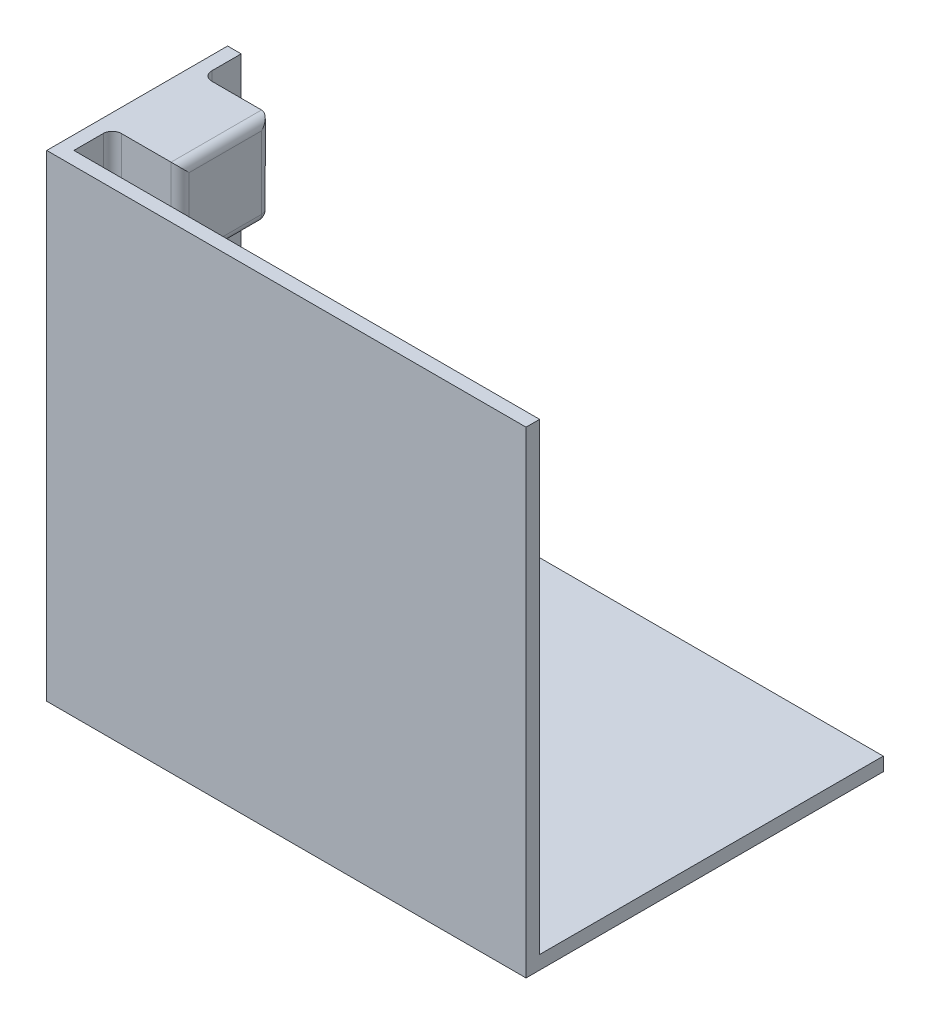
ISO-10303-21;
HEADER;
FILE_DESCRIPTION(('STEP AP214'),'2;1');
FILE_NAME('part.step','',(''),(''),'','','');
FILE_SCHEMA(('AUTOMOTIVE_DESIGN { 1 0 10303 214 1 1 1 1 }'));
ENDSEC;
DATA;
#1=APPLICATION_CONTEXT('core data for automotive mechanical design processes');
#2=APPLICATION_PROTOCOL_DEFINITION('international standard','automotive_design',2000,#1);
#3=PRODUCT_CONTEXT('',#1,'mechanical');
#4=PRODUCT('Part','Part','',(#3));
#5=PRODUCT_RELATED_PRODUCT_CATEGORY('part','',(#4));
#6=PRODUCT_DEFINITION_FORMATION('','',#4);
#7=PRODUCT_DEFINITION_CONTEXT('part definition',#1,'design');
#8=PRODUCT_DEFINITION('design','',#6,#7);
#9=PRODUCT_DEFINITION_SHAPE('','',#8);
#10=(LENGTH_UNIT() NAMED_UNIT(*) SI_UNIT(.MILLI.,.METRE.));
#11=(NAMED_UNIT(*) PLANE_ANGLE_UNIT() SI_UNIT($,.RADIAN.));
#12=(NAMED_UNIT(*) SI_UNIT($,.STERADIAN.) SOLID_ANGLE_UNIT());
#13=UNCERTAINTY_MEASURE_WITH_UNIT(LENGTH_MEASURE(1.E-05),#10,'distance_accuracy_value','');
#14=(GEOMETRIC_REPRESENTATION_CONTEXT(3) GLOBAL_UNCERTAINTY_ASSIGNED_CONTEXT((#13)) GLOBAL_UNIT_ASSIGNED_CONTEXT((#10,
#11,#12)) REPRESENTATION_CONTEXT('',''));
#15=CARTESIAN_POINT('',(0.,0.,0.));
#16=DIRECTION('',(0.,0.,1.));
#17=DIRECTION('',(1.,0.,0.));
#18=AXIS2_PLACEMENT_3D('',#15,#16,#17);
#19=CARTESIAN_POINT('',(-50.,0.,36.5));
#20=DIRECTION('',(-1.,0.,0.));
#21=DIRECTION('',(0.,0.,1.));
#22=AXIS2_PLACEMENT_3D('',#19,#20,#21);
#23=PLANE('',#22);
#24=CARTESIAN_POINT('',(-50.,87.5,26.));
#25=DIRECTION('',(-1.,0.,0.));
#26=DIRECTION('',(0.,0.,1.));
#27=AXIS2_PLACEMENT_3D('',#24,#25,#26);
#28=CIRCLE('',#27,4.);
#29=CARTESIAN_POINT('',(-50.,87.5,30.));
#30=VERTEX_POINT('',#29);
#31=CARTESIAN_POINT('',(-50.,83.5,26.));
#32=VERTEX_POINT('',#31);
#33=EDGE_CURVE('E248',#30,#32,#28,.F.);
#34=ORIENTED_EDGE('',*,*,#33,.F.);
#35=DIRECTION('',(0.,-1.,0.));
#36=VECTOR('',#35,1.);
#37=CARTESIAN_POINT('',(-50.,105.5,30.));
#38=LINE('',#37,#36);
#39=CARTESIAN_POINT('',(-50.,105.5,30.));
#40=VERTEX_POINT('',#39);
#41=EDGE_CURVE('E251',#30,#40,#38,.F.);
#42=ORIENTED_EDGE('',*,*,#41,.T.);
#43=DIRECTION('',(0.,0.,1.));
#44=VECTOR('',#43,1.);
#45=CARTESIAN_POINT('',(-50.,105.5,36.5));
#46=LINE('',#45,#44);
#47=CARTESIAN_POINT('',(-50.,105.5,36.5));
#48=VERTEX_POINT('',#47);
#49=EDGE_CURVE('E338',#40,#48,#46,.T.);
#50=ORIENTED_EDGE('',*,*,#49,.T.);
#51=DIRECTION('',(0.,1.,0.));
#52=VECTOR('',#51,1.);
#53=CARTESIAN_POINT('',(-50.,0.,36.5));
#54=LINE('',#53,#52);
#55=CARTESIAN_POINT('',(-50.,3.,36.5));
#56=VERTEX_POINT('',#55);
#57=EDGE_CURVE('E177',#56,#48,#54,.T.);
#58=ORIENTED_EDGE('',*,*,#57,.F.);
#59=DIRECTION('',(0.,0.,-1.));
#60=VECTOR('',#59,1.);
#61=CARTESIAN_POINT('',(-50.,3.,36.5));
#62=LINE('',#61,#60);
#63=CARTESIAN_POINT('',(-50.,3.,-0.5));
#64=VERTEX_POINT('',#63);
#65=EDGE_CURVE('E219',#56,#64,#62,.T.);
#66=ORIENTED_EDGE('',*,*,#65,.T.);
#67=DIRECTION('',(0.,-1.,0.));
#68=VECTOR('',#67,1.);
#69=CARTESIAN_POINT('',(-50.,0.,-0.5));
#70=LINE('',#69,#68);
#71=CARTESIAN_POINT('',(-50.,105.5,-0.5));
#72=VERTEX_POINT('',#71);
#73=EDGE_CURVE('E335',#72,#64,#70,.T.);
#74=ORIENTED_EDGE('',*,*,#73,.F.);
#75=CARTESIAN_POINT('',(-50.,105.5,6.));
#76=VERTEX_POINT('',#75);
#77=EDGE_CURVE('E182',#72,#76,#46,.T.);
#78=ORIENTED_EDGE('',*,*,#77,.T.);
#79=DIRECTION('',(0.,1.,0.));
#80=VECTOR('',#79,1.);
#81=CARTESIAN_POINT('',(-50.,85.5,5.99999999999999));
#82=LINE('',#81,#80);
#83=CARTESIAN_POINT('',(-50.,87.5,6.));
#84=VERTEX_POINT('',#83);
#85=EDGE_CURVE('E243',#76,#84,#82,.F.);
#86=ORIENTED_EDGE('',*,*,#85,.T.);
#87=CARTESIAN_POINT('',(-50.,87.5,9.99999999999999));
#88=DIRECTION('',(-1.,0.,0.));
#89=DIRECTION('',(0.,0.,1.));
#90=AXIS2_PLACEMENT_3D('',#87,#88,#89);
#91=CIRCLE('',#90,4.);
#92=CARTESIAN_POINT('',(-50.,83.5,9.99999999999999));
#93=VERTEX_POINT('',#92);
#94=EDGE_CURVE('E240',#93,#84,#91,.F.);
#95=ORIENTED_EDGE('',*,*,#94,.F.);
#96=DIRECTION('',(0.,0.,-1.));
#97=VECTOR('',#96,1.);
#98=CARTESIAN_POINT('',(-50.,83.5,28.));
#99=LINE('',#98,#97);
#100=EDGE_CURVE('E245',#93,#32,#99,.F.);
#101=ORIENTED_EDGE('',*,*,#100,.T.);
#102=EDGE_LOOP('',(#34,#42,#50,#58,#66,#74,#78,#86,#95,#101));
#103=FACE_BOUND('',#102,.T.);
#104=ADVANCED_FACE('F39',(#103),#23,.F.);
#105=CARTESIAN_POINT('',(0.,105.5,0.));
#106=DIRECTION('',(0.,1.,0.));
#107=DIRECTION('',(0.,0.,1.));
#108=AXIS2_PLACEMENT_3D('',#105,#106,#107);
#109=PLANE('',#108);
#110=DIRECTION('',(-1.,0.,0.));
#111=VECTOR('',#110,1.);
#112=CARTESIAN_POINT('',(-35.,105.5,28.));
#113=LINE('',#112,#111);
#114=CARTESIAN_POINT('',(-37.,105.5,28.));
#115=VERTEX_POINT('',#114);
#116=CARTESIAN_POINT('',(-48.,105.5,28.));
#117=VERTEX_POINT('',#116);
#118=EDGE_CURVE('E313',#115,#117,#113,.T.);
#119=ORIENTED_EDGE('',*,*,#118,.F.);
#120=DIRECTION('',(0.,0.,1.));
#121=VECTOR('',#120,1.);
#122=CARTESIAN_POINT('',(-37.,105.5,8.));
#123=LINE('',#122,#121);
#124=CARTESIAN_POINT('',(-37.,105.5,8.));
#125=VERTEX_POINT('',#124);
#126=EDGE_CURVE('E262',#115,#125,#123,.F.);
#127=ORIENTED_EDGE('',*,*,#126,.T.);
#128=DIRECTION('',(-1.,0.,0.));
#129=VECTOR('',#128,1.);
#130=CARTESIAN_POINT('',(-35.,105.5,8.));
#131=LINE('',#130,#129);
#132=CARTESIAN_POINT('',(-48.,105.5,8.));
#133=VERTEX_POINT('',#132);
#134=EDGE_CURVE('E192',#125,#133,#131,.T.);
#135=ORIENTED_EDGE('',*,*,#134,.T.);
#136=CARTESIAN_POINT('',(-48.,105.5,6.));
#137=DIRECTION('',(0.,1.,0.));
#138=DIRECTION('',(0.,0.,1.));
#139=AXIS2_PLACEMENT_3D('',#136,#137,#138);
#140=CIRCLE('',#139,2.);
#141=EDGE_CURVE('E11',#133,#76,#140,.F.);
#142=ORIENTED_EDGE('',*,*,#141,.T.);
#143=ORIENTED_EDGE('',*,*,#77,.F.);
#144=DIRECTION('',(1.,0.,0.));
#145=VECTOR('',#144,1.);
#146=CARTESIAN_POINT('',(53.,105.5,-0.5));
#147=LINE('',#146,#145);
#148=CARTESIAN_POINT('',(-53.,105.5,-0.5));
#149=VERTEX_POINT('',#148);
#150=EDGE_CURVE('E329',#149,#72,#147,.T.);
#151=ORIENTED_EDGE('',*,*,#150,.F.);
#152=DIRECTION('',(0.,0.,1.));
#153=VECTOR('',#152,1.);
#154=CARTESIAN_POINT('',(-53.,105.5,-39.5));
#155=LINE('',#154,#153);
#156=CARTESIAN_POINT('',(-53.,105.5,39.5));
#157=VERTEX_POINT('',#156);
#158=EDGE_CURVE('E181',#149,#157,#155,.T.);
#159=ORIENTED_EDGE('',*,*,#158,.T.);
#160=DIRECTION('',(1.,0.,0.));
#161=VECTOR('',#160,1.);
#162=CARTESIAN_POINT('',(-53.,105.5,39.5));
#163=LINE('',#162,#161);
#164=CARTESIAN_POINT('',(53.,105.5,39.5));
#165=VERTEX_POINT('',#164);
#166=EDGE_CURVE('E198',#157,#165,#163,.T.);
#167=ORIENTED_EDGE('',*,*,#166,.T.);
#168=DIRECTION('',(0.,0.,-1.));
#169=VECTOR('',#168,1.);
#170=CARTESIAN_POINT('',(53.,105.5,39.5));
#171=LINE('',#170,#169);
#172=CARTESIAN_POINT('',(53.,105.5,36.5));
#173=VERTEX_POINT('',#172);
#174=EDGE_CURVE('E188',#165,#173,#171,.T.);
#175=ORIENTED_EDGE('',*,*,#174,.T.);
#176=DIRECTION('',(1.,0.,0.));
#177=VECTOR('',#176,1.);
#178=CARTESIAN_POINT('',(-50.,105.5,36.5));
#179=LINE('',#178,#177);
#180=EDGE_CURVE('E172',#48,#173,#179,.T.);
#181=ORIENTED_EDGE('',*,*,#180,.F.);
#182=ORIENTED_EDGE('',*,*,#49,.F.);
#183=CARTESIAN_POINT('',(-48.,105.5,30.));
#184=DIRECTION('',(0.,1.,0.));
#185=DIRECTION('',(0.,0.,1.));
#186=AXIS2_PLACEMENT_3D('',#183,#184,#185);
#187=CIRCLE('',#186,2.);
#188=EDGE_CURVE('E48',#40,#117,#187,.F.);
#189=ORIENTED_EDGE('',*,*,#188,.T.);
#190=EDGE_LOOP('',(#119,#127,#135,#142,#143,#151,#159,#167,#175,#181,#182,#189));
#191=FACE_BOUND('',#190,.T.);
#192=ADVANCED_FACE('F196',(#191),#109,.T.);
#193=CARTESIAN_POINT('',(0.,3.,0.));
#194=DIRECTION('',(0.,-1.,0.));
#195=DIRECTION('',(0.,0.,-1.));
#196=AXIS2_PLACEMENT_3D('',#193,#194,#195);
#197=PLANE('',#196);
#198=DIRECTION('',(-1.,0.,0.));
#199=VECTOR('',#198,1.);
#200=CARTESIAN_POINT('',(53.,3.,-0.5));
#201=LINE('',#200,#199);
#202=CARTESIAN_POINT('',(-53.,3.,-0.5));
#203=VERTEX_POINT('',#202);
#204=EDGE_CURVE('E325',#64,#203,#201,.T.);
#205=ORIENTED_EDGE('',*,*,#204,.F.);
#206=ORIENTED_EDGE('',*,*,#65,.F.);
#207=DIRECTION('',(1.,0.,0.));
#208=VECTOR('',#207,1.);
#209=CARTESIAN_POINT('',(-50.,3.,36.5));
#210=LINE('',#209,#208);
#211=CARTESIAN_POINT('',(53.,3.,36.5));
#212=VERTEX_POINT('',#211);
#213=EDGE_CURVE('E229',#56,#212,#210,.T.);
#214=ORIENTED_EDGE('',*,*,#213,.T.);
#215=DIRECTION('',(0.,0.,-1.));
#216=VECTOR('',#215,1.);
#217=CARTESIAN_POINT('',(53.,3.,-0.5));
#218=LINE('',#217,#216);
#219=CARTESIAN_POINT('',(53.,3.,-39.5));
#220=VERTEX_POINT('',#219);
#221=EDGE_CURVE('E190',#212,#220,#218,.T.);
#222=ORIENTED_EDGE('',*,*,#221,.T.);
#223=DIRECTION('',(-1.,0.,0.));
#224=VECTOR('',#223,1.);
#225=CARTESIAN_POINT('',(53.,3.,-39.5));
#226=LINE('',#225,#224);
#227=CARTESIAN_POINT('',(-53.,3.,-39.5));
#228=VERTEX_POINT('',#227);
#229=EDGE_CURVE('E191',#220,#228,#226,.T.);
#230=ORIENTED_EDGE('',*,*,#229,.T.);
#231=DIRECTION('',(0.,0.,-1.));
#232=VECTOR('',#231,1.);
#233=CARTESIAN_POINT('',(-53.,3.,-0.5));
#234=LINE('',#233,#232);
#235=EDGE_CURVE('E332',#203,#228,#234,.T.);
#236=ORIENTED_EDGE('',*,*,#235,.F.);
#237=EDGE_LOOP('',(#205,#206,#214,#222,#230,#236));
#238=FACE_BOUND('',#237,.T.);
#239=ADVANCED_FACE('F360',(#238),#197,.F.);
#240=CARTESIAN_POINT('',(-50.,0.,36.5));
#241=DIRECTION('',(0.,0.,1.));
#242=DIRECTION('',(1.,0.,0.));
#243=AXIS2_PLACEMENT_3D('',#240,#241,#242);
#244=PLANE('',#243);
#245=ORIENTED_EDGE('',*,*,#180,.T.);
#246=DIRECTION('',(0.,-1.,0.));
#247=VECTOR('',#246,1.);
#248=CARTESIAN_POINT('',(53.,105.5,36.5));
#249=LINE('',#248,#247);
#250=EDGE_CURVE('E175',#173,#212,#249,.T.);
#251=ORIENTED_EDGE('',*,*,#250,.T.);
#252=ORIENTED_EDGE('',*,*,#213,.F.);
#253=ORIENTED_EDGE('',*,*,#57,.T.);
#254=EDGE_LOOP('',(#245,#251,#252,#253));
#255=FACE_BOUND('',#254,.T.);
#256=ADVANCED_FACE('F174',(#255),#244,.F.);
#257=CARTESIAN_POINT('',(53.,0.,-39.5));
#258=DIRECTION('',(0.,0.,-1.));
#259=DIRECTION('',(-1.,0.,0.));
#260=AXIS2_PLACEMENT_3D('',#257,#258,#259);
#261=PLANE('',#260);
#262=ORIENTED_EDGE('',*,*,#229,.F.);
#263=DIRECTION('',(0.,1.,0.));
#264=VECTOR('',#263,1.);
#265=CARTESIAN_POINT('',(53.,0.,-39.5));
#266=LINE('',#265,#264);
#267=CARTESIAN_POINT('',(53.,0.,-39.5));
#268=VERTEX_POINT('',#267);
#269=EDGE_CURVE('E217',#268,#220,#266,.T.);
#270=ORIENTED_EDGE('',*,*,#269,.F.);
#271=DIRECTION('',(-1.,0.,0.));
#272=VECTOR('',#271,1.);
#273=CARTESIAN_POINT('',(53.,0.,-39.5));
#274=LINE('',#273,#272);
#275=CARTESIAN_POINT('',(-53.,0.,-39.5));
#276=VERTEX_POINT('',#275);
#277=EDGE_CURVE('E200',#268,#276,#274,.T.);
#278=ORIENTED_EDGE('',*,*,#277,.T.);
#279=DIRECTION('',(0.,1.,0.));
#280=VECTOR('',#279,1.);
#281=CARTESIAN_POINT('',(-53.,0.,-39.5));
#282=LINE('',#281,#280);
#283=EDGE_CURVE('E216',#276,#228,#282,.T.);
#284=ORIENTED_EDGE('',*,*,#283,.T.);
#285=EDGE_LOOP('',(#262,#270,#278,#284));
#286=FACE_BOUND('',#285,.T.);
#287=ADVANCED_FACE('F356',(#286),#261,.T.);
#288=CARTESIAN_POINT('',(53.,0.,39.5));
#289=DIRECTION('',(1.,0.,0.));
#290=DIRECTION('',(0.,0.,-1.));
#291=AXIS2_PLACEMENT_3D('',#288,#289,#290);
#292=PLANE('',#291);
#293=ORIENTED_EDGE('',*,*,#250,.F.);
#294=ORIENTED_EDGE('',*,*,#174,.F.);
#295=DIRECTION('',(0.,1.,0.));
#296=VECTOR('',#295,1.);
#297=CARTESIAN_POINT('',(53.,0.,39.5));
#298=LINE('',#297,#296);
#299=CARTESIAN_POINT('',(53.,0.,39.5));
#300=VERTEX_POINT('',#299);
#301=EDGE_CURVE('E220',#300,#165,#298,.T.);
#302=ORIENTED_EDGE('',*,*,#301,.F.);
#303=DIRECTION('',(0.,0.,-1.));
#304=VECTOR('',#303,1.);
#305=CARTESIAN_POINT('',(53.,0.,39.5));
#306=LINE('',#305,#304);
#307=EDGE_CURVE('E213',#300,#268,#306,.T.);
#308=ORIENTED_EDGE('',*,*,#307,.T.);
#309=ORIENTED_EDGE('',*,*,#269,.T.);
#310=ORIENTED_EDGE('',*,*,#221,.F.);
#311=EDGE_LOOP('',(#293,#294,#302,#308,#309,#310));
#312=FACE_BOUND('',#311,.T.);
#313=ADVANCED_FACE('F187',(#312),#292,.T.);
#314=CARTESIAN_POINT('',(-53.,0.,39.5));
#315=DIRECTION('',(0.,0.,1.));
#316=DIRECTION('',(1.,0.,0.));
#317=AXIS2_PLACEMENT_3D('',#314,#315,#316);
#318=PLANE('',#317);
#319=ORIENTED_EDGE('',*,*,#301,.T.);
#320=ORIENTED_EDGE('',*,*,#166,.F.);
#321=DIRECTION('',(0.,1.,0.));
#322=VECTOR('',#321,1.);
#323=CARTESIAN_POINT('',(-53.,0.,39.5));
#324=LINE('',#323,#322);
#325=CARTESIAN_POINT('',(-53.,0.,39.5));
#326=VERTEX_POINT('',#325);
#327=EDGE_CURVE('E222',#326,#157,#324,.T.);
#328=ORIENTED_EDGE('',*,*,#327,.F.);
#329=DIRECTION('',(1.,0.,0.));
#330=VECTOR('',#329,1.);
#331=CARTESIAN_POINT('',(-53.,0.,39.5));
#332=LINE('',#331,#330);
#333=EDGE_CURVE('E210',#326,#300,#332,.T.);
#334=ORIENTED_EDGE('',*,*,#333,.T.);
#335=EDGE_LOOP('',(#319,#320,#328,#334));
#336=FACE_BOUND('',#335,.T.);
#337=ADVANCED_FACE('F349',(#336),#318,.T.);
#338=CARTESIAN_POINT('',(-53.,0.,-39.5));
#339=DIRECTION('',(-1.,0.,0.));
#340=DIRECTION('',(0.,0.,1.));
#341=AXIS2_PLACEMENT_3D('',#338,#339,#340);
#342=PLANE('',#341);
#343=ORIENTED_EDGE('',*,*,#235,.T.);
#344=ORIENTED_EDGE('',*,*,#283,.F.);
#345=DIRECTION('',(0.,0.,1.));
#346=VECTOR('',#345,1.);
#347=CARTESIAN_POINT('',(-53.,0.,-39.5));
#348=LINE('',#347,#346);
#349=EDGE_CURVE('E207',#276,#326,#348,.T.);
#350=ORIENTED_EDGE('',*,*,#349,.T.);
#351=ORIENTED_EDGE('',*,*,#327,.T.);
#352=ORIENTED_EDGE('',*,*,#158,.F.);
#353=DIRECTION('',(0.,1.,0.));
#354=VECTOR('',#353,1.);
#355=CARTESIAN_POINT('',(-53.,105.5,-0.5));
#356=LINE('',#355,#354);
#357=EDGE_CURVE('E327',#203,#149,#356,.T.);
#358=ORIENTED_EDGE('',*,*,#357,.F.);
#359=EDGE_LOOP('',(#343,#344,#350,#351,#352,#358));
#360=FACE_BOUND('',#359,.T.);
#361=ADVANCED_FACE('F345',(#360),#342,.T.);
#362=CARTESIAN_POINT('',(0.,0.,0.));
#363=DIRECTION('',(0.,-1.,0.));
#364=DIRECTION('',(0.,0.,-1.));
#365=AXIS2_PLACEMENT_3D('',#362,#363,#364);
#366=PLANE('',#365);
#367=ORIENTED_EDGE('',*,*,#277,.F.);
#368=ORIENTED_EDGE('',*,*,#307,.F.);
#369=ORIENTED_EDGE('',*,*,#333,.F.);
#370=ORIENTED_EDGE('',*,*,#349,.F.);
#371=EDGE_LOOP('',(#367,#368,#369,#370));
#372=FACE_BOUND('',#371,.T.);
#373=ADVANCED_FACE('F353',(#372),#366,.T.);
#374=CARTESIAN_POINT('',(0.,0.,-0.5));
#375=DIRECTION('',(0.,0.,-1.));
#376=DIRECTION('',(-1.,0.,0.));
#377=AXIS2_PLACEMENT_3D('',#374,#375,#376);
#378=PLANE('',#377);
#379=ORIENTED_EDGE('',*,*,#73,.T.);
#380=ORIENTED_EDGE('',*,*,#204,.T.);
#381=ORIENTED_EDGE('',*,*,#357,.T.);
#382=ORIENTED_EDGE('',*,*,#150,.T.);
#383=EDGE_LOOP('',(#379,#380,#381,#382));
#384=FACE_BOUND('',#383,.T.);
#385=ADVANCED_FACE('F362',(#384),#378,.T.);
#386=CARTESIAN_POINT('',(-35.,105.5,8.));
#387=DIRECTION('',(0.,0.,1.));
#388=DIRECTION('',(0.,-1.,0.));
#389=AXIS2_PLACEMENT_3D('',#386,#387,#388);
#390=PLANE('',#389);
#391=ORIENTED_EDGE('',*,*,#134,.F.);
#392=DIRECTION('',(0.,1.,0.));
#393=VECTOR('',#392,1.);
#394=CARTESIAN_POINT('',(-37.,105.5,8.));
#395=LINE('',#394,#393);
#396=CARTESIAN_POINT('',(-37.,87.5,7.99999999999999));
#397=VERTEX_POINT('',#396);
#398=EDGE_CURVE('E56',#125,#397,#395,.F.);
#399=ORIENTED_EDGE('',*,*,#398,.T.);
#400=DIRECTION('',(-1.,0.,0.));
#401=VECTOR('',#400,1.);
#402=CARTESIAN_POINT('',(-35.,87.5,7.99999999999999));
#403=LINE('',#402,#401);
#404=CARTESIAN_POINT('',(-48.,87.5,7.99999999999999));
#405=VERTEX_POINT('',#404);
#406=EDGE_CURVE('E61',#397,#405,#403,.T.);
#407=ORIENTED_EDGE('',*,*,#406,.T.);
#408=DIRECTION('',(0.,1.,0.));
#409=VECTOR('',#408,1.);
#410=CARTESIAN_POINT('',(-48.,105.5,8.));
#411=LINE('',#410,#409);
#412=EDGE_CURVE('E270',#405,#133,#411,.T.);
#413=ORIENTED_EDGE('',*,*,#412,.T.);
#414=EDGE_LOOP('',(#391,#399,#407,#413));
#415=FACE_BOUND('',#414,.T.);
#416=ADVANCED_FACE('F404',(#415),#390,.F.);
#417=CARTESIAN_POINT('',(-35.,105.5,28.));
#418=DIRECTION('',(0.,0.,-1.));
#419=DIRECTION('',(-1.,0.,0.));
#420=AXIS2_PLACEMENT_3D('',#417,#418,#419);
#421=PLANE('',#420);
#422=DIRECTION('',(-1.,0.,0.));
#423=VECTOR('',#422,1.);
#424=CARTESIAN_POINT('',(-35.,87.5,28.));
#425=LINE('',#424,#423);
#426=CARTESIAN_POINT('',(-48.,87.5,28.));
#427=VERTEX_POINT('',#426);
#428=CARTESIAN_POINT('',(-37.,87.5,28.));
#429=VERTEX_POINT('',#428);
#430=EDGE_CURVE('E266',#427,#429,#425,.F.);
#431=ORIENTED_EDGE('',*,*,#430,.T.);
#432=DIRECTION('',(0.,-1.,0.));
#433=VECTOR('',#432,1.);
#434=CARTESIAN_POINT('',(-37.,105.5,28.));
#435=LINE('',#434,#433);
#436=EDGE_CURVE('E268',#429,#115,#435,.F.);
#437=ORIENTED_EDGE('',*,*,#436,.T.);
#438=ORIENTED_EDGE('',*,*,#118,.T.);
#439=DIRECTION('',(0.,-1.,0.));
#440=VECTOR('',#439,1.);
#441=CARTESIAN_POINT('',(-48.,85.5,28.));
#442=LINE('',#441,#440);
#443=EDGE_CURVE('E264',#117,#427,#442,.T.);
#444=ORIENTED_EDGE('',*,*,#443,.T.);
#445=EDGE_LOOP('',(#431,#437,#438,#444));
#446=FACE_BOUND('',#445,.T.);
#447=ADVANCED_FACE('F372',(#446),#421,.F.);
#448=CARTESIAN_POINT('',(-35.,85.5,7.99999999999999));
#449=DIRECTION('',(0.,1.,0.));
#450=DIRECTION('',(0.,0.,1.));
#451=AXIS2_PLACEMENT_3D('',#448,#449,#450);
#452=PLANE('',#451);
#453=DIRECTION('',(0.,0.,-1.));
#454=VECTOR('',#453,1.);
#455=CARTESIAN_POINT('',(-37.,85.5,7.99999999999999));
#456=LINE('',#455,#454);
#457=CARTESIAN_POINT('',(-37.,85.5,9.99999999999999));
#458=VERTEX_POINT('',#457);
#459=CARTESIAN_POINT('',(-37.,85.5,26.));
#460=VERTEX_POINT('',#459);
#461=EDGE_CURVE('E233',#458,#460,#456,.F.);
#462=ORIENTED_EDGE('',*,*,#461,.T.);
#463=DIRECTION('',(-1.,0.,0.));
#464=VECTOR('',#463,1.);
#465=CARTESIAN_POINT('',(-35.,85.5,26.));
#466=LINE('',#465,#464);
#467=CARTESIAN_POINT('',(-48.,85.5,26.));
#468=VERTEX_POINT('',#467);
#469=EDGE_CURVE('E238',#460,#468,#466,.T.);
#470=ORIENTED_EDGE('',*,*,#469,.T.);
#471=DIRECTION('',(0.,0.,-1.));
#472=VECTOR('',#471,1.);
#473=CARTESIAN_POINT('',(-48.,85.5,8.));
#474=LINE('',#473,#472);
#475=CARTESIAN_POINT('',(-48.,85.5,9.99999999999999));
#476=VERTEX_POINT('',#475);
#477=EDGE_CURVE('E235',#468,#476,#474,.T.);
#478=ORIENTED_EDGE('',*,*,#477,.T.);
#479=DIRECTION('',(-1.,0.,0.));
#480=VECTOR('',#479,1.);
#481=CARTESIAN_POINT('',(-35.,85.5,9.99999999999999));
#482=LINE('',#481,#480);
#483=EDGE_CURVE('E231',#476,#458,#482,.F.);
#484=ORIENTED_EDGE('',*,*,#483,.T.);
#485=EDGE_LOOP('',(#462,#470,#478,#484));
#486=FACE_BOUND('',#485,.T.);
#487=ADVANCED_FACE('F538',(#486),#452,.F.);
#488=CARTESIAN_POINT('',(-35.,0.,0.));
#489=DIRECTION('',(-1.,0.,0.));
#490=DIRECTION('',(0.,0.,1.));
#491=AXIS2_PLACEMENT_3D('',#488,#489,#490);
#492=PLANE('',#491);
#493=DIRECTION('',(0.,0.,1.));
#494=VECTOR('',#493,1.);
#495=CARTESIAN_POINT('',(-35.,103.5,28.));
#496=LINE('',#495,#494);
#497=CARTESIAN_POINT('',(-35.,103.5,10.));
#498=VERTEX_POINT('',#497);
#499=CARTESIAN_POINT('',(-35.,103.5,26.));
#500=VERTEX_POINT('',#499);
#501=EDGE_CURVE('E255',#498,#500,#496,.T.);
#502=ORIENTED_EDGE('',*,*,#501,.T.);
#503=DIRECTION('',(0.,-1.,0.));
#504=VECTOR('',#503,1.);
#505=CARTESIAN_POINT('',(-35.,0.,26.));
#506=LINE('',#505,#504);
#507=CARTESIAN_POINT('',(-35.,87.5,26.));
#508=VERTEX_POINT('',#507);
#509=EDGE_CURVE('E260',#500,#508,#506,.T.);
#510=ORIENTED_EDGE('',*,*,#509,.T.);
#511=DIRECTION('',(0.,0.,-1.));
#512=VECTOR('',#511,1.);
#513=CARTESIAN_POINT('',(-35.,87.5,0.));
#514=LINE('',#513,#512);
#515=CARTESIAN_POINT('',(-35.,87.5,9.99999999999999));
#516=VERTEX_POINT('',#515);
#517=EDGE_CURVE('E257',#508,#516,#514,.T.);
#518=ORIENTED_EDGE('',*,*,#517,.T.);
#519=DIRECTION('',(0.,1.,0.));
#520=VECTOR('',#519,1.);
#521=CARTESIAN_POINT('',(-35.,0.,9.99999999999997));
#522=LINE('',#521,#520);
#523=EDGE_CURVE('E253',#516,#498,#522,.T.);
#524=ORIENTED_EDGE('',*,*,#523,.T.);
#525=EDGE_LOOP('',(#502,#510,#518,#524));
#526=FACE_BOUND('',#525,.T.);
#527=ADVANCED_FACE('F530',(#526),#492,.F.);
#528=CARTESIAN_POINT('',(-37.,103.5,0.));
#529=DIRECTION('',(0.,0.,-1.));
#530=DIRECTION('',(-1.,0.,0.));
#531=AXIS2_PLACEMENT_3D('',#528,#529,#530);
#532=CYLINDRICAL_SURFACE('',#531,2.);
#533=CARTESIAN_POINT('',(-37.,103.5,10.));
#534=DIRECTION('',(0.,0.707106781186547,0.707106781186548));
#535=DIRECTION('',(0.,0.707106781186548,-0.707106781186547));
#536=AXIS2_PLACEMENT_3D('',#533,#534,#535);
#537=ELLIPSE('',#536,2.82842712474619,2.);
#538=EDGE_CURVE('E307',#125,#498,#537,.F.);
#539=ORIENTED_EDGE('',*,*,#538,.F.);
#540=ORIENTED_EDGE('',*,*,#126,.F.);
#541=CARTESIAN_POINT('',(-37.,103.5,26.));
#542=DIRECTION('',(0.,-0.707106781186547,0.707106781186547));
#543=DIRECTION('',(0.,-0.707106781186547,-0.707106781186547));
#544=AXIS2_PLACEMENT_3D('',#541,#542,#543);
#545=ELLIPSE('',#544,2.82842712474619,2.);
#546=EDGE_CURVE('E43',#500,#115,#545,.T.);
#547=ORIENTED_EDGE('',*,*,#546,.F.);
#548=ORIENTED_EDGE('',*,*,#501,.F.);
#549=EDGE_LOOP('',(#539,#540,#547,#548));
#550=FACE_BOUND('',#549,.T.);
#551=ADVANCED_FACE('F41',(#550),#532,.T.);
#552=CARTESIAN_POINT('',(-37.,0.,26.));
#553=DIRECTION('',(0.,-1.,0.));
#554=DIRECTION('',(0.,0.,-1.));
#555=AXIS2_PLACEMENT_3D('',#552,#553,#554);
#556=CYLINDRICAL_SURFACE('',#555,2.);
#557=ORIENTED_EDGE('',*,*,#546,.T.);
#558=ORIENTED_EDGE('',*,*,#436,.F.);
#559=CARTESIAN_POINT('',(-37.,87.5,26.));
#560=DIRECTION('',(0.,-1.,0.));
#561=DIRECTION('',(0.,0.,-1.));
#562=AXIS2_PLACEMENT_3D('',#559,#560,#561);
#563=CIRCLE('',#562,2.);
#564=EDGE_CURVE('E305',#508,#429,#563,.T.);
#565=ORIENTED_EDGE('',*,*,#564,.F.);
#566=ORIENTED_EDGE('',*,*,#509,.F.);
#567=EDGE_LOOP('',(#557,#558,#565,#566));
#568=FACE_BOUND('',#567,.T.);
#569=ADVANCED_FACE('F383',(#568),#556,.T.);
#570=CARTESIAN_POINT('',(-37.,87.5,0.));
#571=DIRECTION('',(0.,0.,-1.));
#572=DIRECTION('',(-1.,0.,0.));
#573=AXIS2_PLACEMENT_3D('',#570,#571,#572);
#574=CYLINDRICAL_SURFACE('',#573,2.);
#575=CARTESIAN_POINT('',(-37.,87.5,9.99999999999999));
#576=DIRECTION('',(0.,0.,-1.));
#577=DIRECTION('',(-1.,0.,0.));
#578=AXIS2_PLACEMENT_3D('',#575,#576,#577);
#579=CIRCLE('',#578,2.);
#580=EDGE_CURVE('E299',#516,#458,#579,.T.);
#581=ORIENTED_EDGE('',*,*,#580,.F.);
#582=ORIENTED_EDGE('',*,*,#517,.F.);
#583=CARTESIAN_POINT('',(-37.,87.5,26.));
#584=DIRECTION('',(0.,0.,1.));
#585=DIRECTION('',(1.,0.,0.));
#586=AXIS2_PLACEMENT_3D('',#583,#584,#585);
#587=CIRCLE('',#586,2.);
#588=EDGE_CURVE('E302',#460,#508,#587,.T.);
#589=ORIENTED_EDGE('',*,*,#588,.F.);
#590=ORIENTED_EDGE('',*,*,#461,.F.);
#591=EDGE_LOOP('',(#581,#582,#589,#590));
#592=FACE_BOUND('',#591,.T.);
#593=ADVANCED_FACE('F505',(#592),#574,.T.);
#594=CARTESIAN_POINT('',(-37.,0.,9.99999999999997));
#595=DIRECTION('',(0.,1.,0.));
#596=DIRECTION('',(0.,0.,1.));
#597=AXIS2_PLACEMENT_3D('',#594,#595,#596);
#598=CYLINDRICAL_SURFACE('',#597,2.);
#599=ORIENTED_EDGE('',*,*,#538,.T.);
#600=ORIENTED_EDGE('',*,*,#523,.F.);
#601=CARTESIAN_POINT('',(-37.,87.5,9.99999999999999));
#602=DIRECTION('',(0.,-1.,0.));
#603=DIRECTION('',(0.,0.,-1.));
#604=AXIS2_PLACEMENT_3D('',#601,#602,#603);
#605=CIRCLE('',#604,2.);
#606=EDGE_CURVE('E297',#397,#516,#605,.T.);
#607=ORIENTED_EDGE('',*,*,#606,.F.);
#608=ORIENTED_EDGE('',*,*,#398,.F.);
#609=EDGE_LOOP('',(#599,#600,#607,#608));
#610=FACE_BOUND('',#609,.T.);
#611=ADVANCED_FACE('F387',(#610),#598,.T.);
#612=CARTESIAN_POINT('',(-37.,87.5,26.));
#613=DIRECTION('',(1.,0.,0.));
#614=DIRECTION('',(0.,0.,-1.));
#615=AXIS2_PLACEMENT_3D('',#612,#613,#614);
#616=SPHERICAL_SURFACE('',#615,2.);
#617=ORIENTED_EDGE('',*,*,#588,.T.);
#618=ORIENTED_EDGE('',*,*,#564,.T.);
#619=CARTESIAN_POINT('',(-37.,87.5,26.));
#620=DIRECTION('',(1.,0.,0.));
#621=DIRECTION('',(0.,0.,-1.));
#622=AXIS2_PLACEMENT_3D('',#619,#620,#621);
#623=CIRCLE('',#622,2.);
#624=EDGE_CURVE('E294',#460,#429,#623,.F.);
#625=ORIENTED_EDGE('',*,*,#624,.F.);
#626=EDGE_LOOP('',(#617,#618,#625));
#627=FACE_BOUND('',#626,.T.);
#628=ADVANCED_FACE('F380',(#627),#616,.T.);
#629=CARTESIAN_POINT('',(-37.,87.5,9.99999999999999));
#630=DIRECTION('',(1.,0.,0.));
#631=DIRECTION('',(0.,0.,-1.));
#632=AXIS2_PLACEMENT_3D('',#629,#630,#631);
#633=SPHERICAL_SURFACE('',#632,2.);
#634=ORIENTED_EDGE('',*,*,#606,.T.);
#635=ORIENTED_EDGE('',*,*,#580,.T.);
#636=CARTESIAN_POINT('',(-37.,87.5,9.99999999999999));
#637=DIRECTION('',(1.,0.,0.));
#638=DIRECTION('',(0.,0.,-1.));
#639=AXIS2_PLACEMENT_3D('',#636,#637,#638);
#640=CIRCLE('',#639,2.);
#641=EDGE_CURVE('E291',#397,#458,#640,.F.);
#642=ORIENTED_EDGE('',*,*,#641,.F.);
#643=EDGE_LOOP('',(#634,#635,#642));
#644=FACE_BOUND('',#643,.T.);
#645=ADVANCED_FACE('F391',(#644),#633,.T.);
#646=CARTESIAN_POINT('',(-48.,105.5,30.));
#647=DIRECTION('',(0.,1.,0.));
#648=DIRECTION('',(0.,0.,1.));
#649=AXIS2_PLACEMENT_3D('',#646,#647,#648);
#650=CYLINDRICAL_SURFACE('',#649,2.);
#651=ORIENTED_EDGE('',*,*,#188,.F.);
#652=ORIENTED_EDGE('',*,*,#41,.F.);
#653=CARTESIAN_POINT('',(-48.,87.5,30.));
#654=DIRECTION('',(0.,1.,0.));
#655=DIRECTION('',(0.,0.,1.));
#656=AXIS2_PLACEMENT_3D('',#653,#654,#655);
#657=CIRCLE('',#656,2.);
#658=EDGE_CURVE('E288',#427,#30,#657,.T.);
#659=ORIENTED_EDGE('',*,*,#658,.F.);
#660=ORIENTED_EDGE('',*,*,#443,.F.);
#661=EDGE_LOOP('',(#651,#652,#659,#660));
#662=FACE_BOUND('',#661,.T.);
#663=ADVANCED_FACE('F369',(#662),#650,.F.);
#664=CARTESIAN_POINT('',(-35.,87.5,26.));
#665=DIRECTION('',(-1.,0.,0.));
#666=DIRECTION('',(0.,0.,1.));
#667=AXIS2_PLACEMENT_3D('',#664,#665,#666);
#668=CYLINDRICAL_SURFACE('',#667,2.);
#669=ORIENTED_EDGE('',*,*,#624,.T.);
#670=ORIENTED_EDGE('',*,*,#430,.F.);
#671=CARTESIAN_POINT('',(-48.,87.5,26.));
#672=DIRECTION('',(-1.,0.,0.));
#673=DIRECTION('',(0.,0.,1.));
#674=AXIS2_PLACEMENT_3D('',#671,#672,#673);
#675=CIRCLE('',#674,2.);
#676=EDGE_CURVE('E285',#468,#427,#675,.T.);
#677=ORIENTED_EDGE('',*,*,#676,.F.);
#678=ORIENTED_EDGE('',*,*,#469,.F.);
#679=EDGE_LOOP('',(#669,#670,#677,#678));
#680=FACE_BOUND('',#679,.T.);
#681=ADVANCED_FACE('F375',(#680),#668,.T.);
#682=CARTESIAN_POINT('',(-35.,87.5,9.99999999999999));
#683=DIRECTION('',(-1.,0.,0.));
#684=DIRECTION('',(0.,0.,1.));
#685=AXIS2_PLACEMENT_3D('',#682,#683,#684);
#686=CYLINDRICAL_SURFACE('',#685,2.);
#687=ORIENTED_EDGE('',*,*,#641,.T.);
#688=ORIENTED_EDGE('',*,*,#483,.F.);
#689=CARTESIAN_POINT('',(-48.,87.5,9.99999999999999));
#690=DIRECTION('',(-1.,0.,0.));
#691=DIRECTION('',(0.,0.,1.));
#692=AXIS2_PLACEMENT_3D('',#689,#690,#691);
#693=CIRCLE('',#692,2.);
#694=EDGE_CURVE('E282',#405,#476,#693,.T.);
#695=ORIENTED_EDGE('',*,*,#694,.F.);
#696=ORIENTED_EDGE('',*,*,#406,.F.);
#697=EDGE_LOOP('',(#687,#688,#695,#696));
#698=FACE_BOUND('',#697,.T.);
#699=ADVANCED_FACE('F395',(#698),#686,.T.);
#700=CARTESIAN_POINT('',(-48.,105.5,6.));
#701=DIRECTION('',(0.,-1.,0.));
#702=DIRECTION('',(0.,0.,-1.));
#703=AXIS2_PLACEMENT_3D('',#700,#701,#702);
#704=CYLINDRICAL_SURFACE('',#703,2.);
#705=ORIENTED_EDGE('',*,*,#141,.F.);
#706=ORIENTED_EDGE('',*,*,#412,.F.);
#707=CARTESIAN_POINT('',(-48.,87.5,6.));
#708=DIRECTION('',(0.,1.,0.));
#709=DIRECTION('',(0.,0.,1.));
#710=AXIS2_PLACEMENT_3D('',#707,#708,#709);
#711=CIRCLE('',#710,2.);
#712=EDGE_CURVE('E279',#84,#405,#711,.T.);
#713=ORIENTED_EDGE('',*,*,#712,.F.);
#714=ORIENTED_EDGE('',*,*,#85,.F.);
#715=EDGE_LOOP('',(#705,#706,#713,#714));
#716=FACE_BOUND('',#715,.T.);
#717=ADVANCED_FACE('F403',(#716),#704,.F.);
#718=CARTESIAN_POINT('',(-48.,87.5,26.));
#719=DIRECTION('',(-1.,0.,0.));
#720=DIRECTION('',(0.,0.,1.));
#721=AXIS2_PLACEMENT_3D('',#718,#719,#720);
#722=TOROIDAL_SURFACE('',#721,4.,2.);
#723=ORIENTED_EDGE('',*,*,#658,.T.);
#724=ORIENTED_EDGE('',*,*,#33,.T.);
#725=CARTESIAN_POINT('',(-48.,83.5,26.));
#726=DIRECTION('',(0.,0.,-1.));
#727=DIRECTION('',(-1.,0.,0.));
#728=AXIS2_PLACEMENT_3D('',#725,#726,#727);
#729=CIRCLE('',#728,2.);
#730=EDGE_CURVE('E277',#468,#32,#729,.F.);
#731=ORIENTED_EDGE('',*,*,#730,.F.);
#732=ORIENTED_EDGE('',*,*,#676,.T.);
#733=EDGE_LOOP('',(#723,#724,#731,#732));
#734=FACE_BOUND('',#733,.T.);
#735=ADVANCED_FACE('F410',(#734),#722,.F.);
#736=CARTESIAN_POINT('',(-48.,87.5,9.99999999999999));
#737=DIRECTION('',(-1.,0.,0.));
#738=DIRECTION('',(0.,0.,1.));
#739=AXIS2_PLACEMENT_3D('',#736,#737,#738);
#740=TOROIDAL_SURFACE('',#739,4.,2.);
#741=ORIENTED_EDGE('',*,*,#712,.T.);
#742=ORIENTED_EDGE('',*,*,#694,.T.);
#743=CARTESIAN_POINT('',(-48.,83.5,9.99999999999999));
#744=DIRECTION('',(0.,0.,1.));
#745=DIRECTION('',(1.,0.,0.));
#746=AXIS2_PLACEMENT_3D('',#743,#744,#745);
#747=CIRCLE('',#746,2.);
#748=EDGE_CURVE('E275',#93,#476,#747,.F.);
#749=ORIENTED_EDGE('',*,*,#748,.F.);
#750=ORIENTED_EDGE('',*,*,#94,.T.);
#751=EDGE_LOOP('',(#741,#742,#749,#750));
#752=FACE_BOUND('',#751,.T.);
#753=ADVANCED_FACE('F399',(#752),#740,.F.);
#754=CARTESIAN_POINT('',(-48.,83.5,7.99999999999999));
#755=DIRECTION('',(0.,0.,1.));
#756=DIRECTION('',(1.,0.,0.));
#757=AXIS2_PLACEMENT_3D('',#754,#755,#756);
#758=CYLINDRICAL_SURFACE('',#757,2.);
#759=ORIENTED_EDGE('',*,*,#730,.T.);
#760=ORIENTED_EDGE('',*,*,#100,.F.);
#761=ORIENTED_EDGE('',*,*,#748,.T.);
#762=ORIENTED_EDGE('',*,*,#477,.F.);
#763=EDGE_LOOP('',(#759,#760,#761,#762));
#764=FACE_BOUND('',#763,.T.);
#765=ADVANCED_FACE('F407',(#764),#758,.F.);
#766=CLOSED_SHELL('',(#104,#192,#239,#256,#287,#313,#337,#361,#373,#385,#416,#447,#487,#527,
#551,#569,#593,#611,#628,#645,#663,#681,#699,#717,#735,#753,#765));
#767=MANIFOLD_SOLID_BREP('B2',#766);
#768=ADVANCED_BREP_SHAPE_REPRESENTATION('',(#18,#767),#14);
#769=SHAPE_DEFINITION_REPRESENTATION(#9,#768);
ENDSEC;
END-ISO-10303-21;
